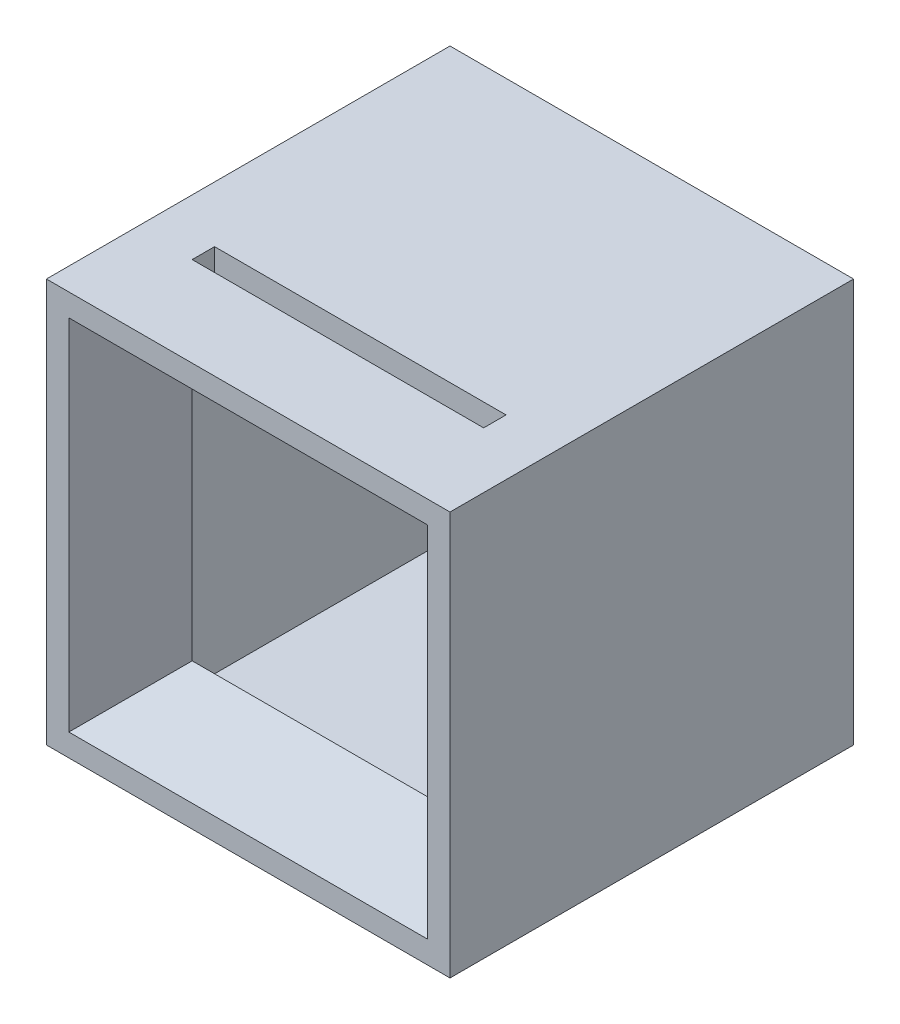
ISO-10303-21;
HEADER;
FILE_DESCRIPTION(('STEP AP214'),'2;1');
FILE_NAME('part.step','',(''),(''),'','','');
FILE_SCHEMA(('AUTOMOTIVE_DESIGN { 1 0 10303 214 1 1 1 1 }'));
ENDSEC;
DATA;
#1=APPLICATION_CONTEXT('core data for automotive mechanical design processes');
#2=APPLICATION_PROTOCOL_DEFINITION('international standard','automotive_design',2000,#1);
#3=PRODUCT_CONTEXT('',#1,'mechanical');
#4=PRODUCT('Part','Part','',(#3));
#5=PRODUCT_RELATED_PRODUCT_CATEGORY('part','',(#4));
#6=PRODUCT_DEFINITION_FORMATION('','',#4);
#7=PRODUCT_DEFINITION_CONTEXT('part definition',#1,'design');
#8=PRODUCT_DEFINITION('design','',#6,#7);
#9=PRODUCT_DEFINITION_SHAPE('','',#8);
#10=(LENGTH_UNIT() NAMED_UNIT(*) SI_UNIT(.MILLI.,.METRE.));
#11=(NAMED_UNIT(*) PLANE_ANGLE_UNIT() SI_UNIT($,.RADIAN.));
#12=(NAMED_UNIT(*) SI_UNIT($,.STERADIAN.) SOLID_ANGLE_UNIT());
#13=UNCERTAINTY_MEASURE_WITH_UNIT(LENGTH_MEASURE(1.E-05),#10,'distance_accuracy_value','');
#14=(GEOMETRIC_REPRESENTATION_CONTEXT(3) GLOBAL_UNCERTAINTY_ASSIGNED_CONTEXT((#13)) GLOBAL_UNIT_ASSIGNED_CONTEXT((#10,
#11,#12)) REPRESENTATION_CONTEXT('',''));
#15=CARTESIAN_POINT('',(0.,0.,0.));
#16=DIRECTION('',(0.,0.,1.));
#17=DIRECTION('',(1.,0.,0.));
#18=AXIS2_PLACEMENT_3D('',#15,#16,#17);
#19=CARTESIAN_POINT('',(0.,0.,457.2));
#20=DIRECTION('',(1.,0.,0.));
#21=DIRECTION('',(0.,0.,-1.));
#22=AXIS2_PLACEMENT_3D('',#19,#20,#21);
#23=PLANE('',#22);
#24=DIRECTION('',(0.,-1.,0.));
#25=VECTOR('',#24,1.);
#26=CARTESIAN_POINT('',(0.,0.,0.));
#27=LINE('',#26,#25);
#28=CARTESIAN_POINT('',(0.,457.2,0.));
#29=VERTEX_POINT('',#28);
#30=CARTESIAN_POINT('',(0.,0.,0.));
#31=VERTEX_POINT('',#30);
#32=EDGE_CURVE('E345',#29,#31,#27,.T.);
#33=ORIENTED_EDGE('',*,*,#32,.T.);
#34=DIRECTION('',(0.,0.,-1.));
#35=VECTOR('',#34,1.);
#36=CARTESIAN_POINT('',(0.,0.,457.2));
#37=LINE('',#36,#35);
#38=CARTESIAN_POINT('',(0.,0.,457.2));
#39=VERTEX_POINT('',#38);
#40=EDGE_CURVE('E369',#39,#31,#37,.T.);
#41=ORIENTED_EDGE('',*,*,#40,.F.);
#42=DIRECTION('',(0.,-1.,0.));
#43=VECTOR('',#42,1.);
#44=CARTESIAN_POINT('',(0.,0.,457.2));
#45=LINE('',#44,#43);
#46=CARTESIAN_POINT('',(0.,457.2,457.2));
#47=VERTEX_POINT('',#46);
#48=EDGE_CURVE('E330',#47,#39,#45,.T.);
#49=ORIENTED_EDGE('',*,*,#48,.F.);
#50=DIRECTION('',(0.,0.,-1.));
#51=VECTOR('',#50,1.);
#52=CARTESIAN_POINT('',(0.,457.2,457.2));
#53=LINE('',#52,#51);
#54=EDGE_CURVE('E344',#47,#29,#53,.T.);
#55=ORIENTED_EDGE('',*,*,#54,.T.);
#56=EDGE_LOOP('',(#33,#41,#49,#55));
#57=FACE_BOUND('',#56,.T.);
#58=ADVANCED_FACE('F52',(#57),#23,.F.);
#59=CARTESIAN_POINT('',(0.,0.,457.2));
#60=DIRECTION('',(0.,1.,0.));
#61=DIRECTION('',(0.,0.,1.));
#62=AXIS2_PLACEMENT_3D('',#59,#60,#61);
#63=PLANE('',#62);
#64=DIRECTION('',(-1.,0.,0.));
#65=VECTOR('',#64,1.);
#66=CARTESIAN_POINT('',(63.5,0.,330.2));
#67=LINE('',#66,#65);
#68=CARTESIAN_POINT('',(393.7,0.,330.2));
#69=VERTEX_POINT('',#68);
#70=CARTESIAN_POINT('',(63.5,0.,330.2));
#71=VERTEX_POINT('',#70);
#72=EDGE_CURVE('E192',#69,#71,#67,.T.);
#73=ORIENTED_EDGE('',*,*,#72,.T.);
#74=DIRECTION('',(0.,0.,1.));
#75=VECTOR('',#74,1.);
#76=CARTESIAN_POINT('',(63.5,0.,355.6));
#77=LINE('',#76,#75);
#78=CARTESIAN_POINT('',(63.5,0.,355.6));
#79=VERTEX_POINT('',#78);
#80=EDGE_CURVE('E173',#71,#79,#77,.T.);
#81=ORIENTED_EDGE('',*,*,#80,.T.);
#82=DIRECTION('',(1.,0.,0.));
#83=VECTOR('',#82,1.);
#84=CARTESIAN_POINT('',(63.5,0.,355.6));
#85=LINE('',#84,#83);
#86=CARTESIAN_POINT('',(393.7,0.,355.6));
#87=VERTEX_POINT('',#86);
#88=EDGE_CURVE('E182',#79,#87,#85,.T.);
#89=ORIENTED_EDGE('',*,*,#88,.T.);
#90=DIRECTION('',(0.,0.,-1.));
#91=VECTOR('',#90,1.);
#92=CARTESIAN_POINT('',(393.7,0.,355.6));
#93=LINE('',#92,#91);
#94=EDGE_CURVE('E187',#87,#69,#93,.T.);
#95=ORIENTED_EDGE('',*,*,#94,.T.);
#96=EDGE_LOOP('',(#73,#81,#89,#95));
#97=FACE_BOUND('',#96,.T.);
#98=DIRECTION('',(1.,0.,0.));
#99=VECTOR('',#98,1.);
#100=CARTESIAN_POINT('',(0.,0.,0.));
#101=LINE('',#100,#99);
#102=CARTESIAN_POINT('',(457.2,0.,0.));
#103=VERTEX_POINT('',#102);
#104=EDGE_CURVE('E349',#31,#103,#101,.T.);
#105=ORIENTED_EDGE('',*,*,#104,.T.);
#106=DIRECTION('',(0.,0.,-1.));
#107=VECTOR('',#106,1.);
#108=CARTESIAN_POINT('',(457.2,0.,457.2));
#109=LINE('',#108,#107);
#110=CARTESIAN_POINT('',(457.2,0.,457.2));
#111=VERTEX_POINT('',#110);
#112=EDGE_CURVE('E365',#111,#103,#109,.T.);
#113=ORIENTED_EDGE('',*,*,#112,.F.);
#114=DIRECTION('',(1.,0.,0.));
#115=VECTOR('',#114,1.);
#116=CARTESIAN_POINT('',(0.,0.,457.2));
#117=LINE('',#116,#115);
#118=EDGE_CURVE('E334',#39,#111,#117,.T.);
#119=ORIENTED_EDGE('',*,*,#118,.F.);
#120=ORIENTED_EDGE('',*,*,#40,.T.);
#121=EDGE_LOOP('',(#105,#113,#119,#120));
#122=FACE_BOUND('',#121,.T.);
#123=ADVANCED_FACE('F189',(#97,#122),#63,.F.);
#124=CARTESIAN_POINT('',(457.2,0.,457.2));
#125=DIRECTION('',(-1.,0.,0.));
#126=DIRECTION('',(0.,0.,1.));
#127=AXIS2_PLACEMENT_3D('',#124,#125,#126);
#128=PLANE('',#127);
#129=DIRECTION('',(0.,1.,0.));
#130=VECTOR('',#129,1.);
#131=CARTESIAN_POINT('',(457.2,0.,0.));
#132=LINE('',#131,#130);
#133=CARTESIAN_POINT('',(457.2,457.2,0.));
#134=VERTEX_POINT('',#133);
#135=EDGE_CURVE('E353',#103,#134,#132,.T.);
#136=ORIENTED_EDGE('',*,*,#135,.T.);
#137=DIRECTION('',(0.,0.,-1.));
#138=VECTOR('',#137,1.);
#139=CARTESIAN_POINT('',(457.2,457.2,457.2));
#140=LINE('',#139,#138);
#141=CARTESIAN_POINT('',(457.2,457.2,457.2));
#142=VERTEX_POINT('',#141);
#143=EDGE_CURVE('E361',#142,#134,#140,.T.);
#144=ORIENTED_EDGE('',*,*,#143,.F.);
#145=DIRECTION('',(0.,1.,0.));
#146=VECTOR('',#145,1.);
#147=CARTESIAN_POINT('',(457.2,0.,457.2));
#148=LINE('',#147,#146);
#149=EDGE_CURVE('E338',#111,#142,#148,.T.);
#150=ORIENTED_EDGE('',*,*,#149,.F.);
#151=ORIENTED_EDGE('',*,*,#112,.T.);
#152=EDGE_LOOP('',(#136,#144,#150,#151));
#153=FACE_BOUND('',#152,.T.);
#154=ADVANCED_FACE('F443',(#153),#128,.F.);
#155=CARTESIAN_POINT('',(0.,457.2,457.2));
#156=DIRECTION('',(0.,-1.,0.));
#157=DIRECTION('',(0.,0.,-1.));
#158=AXIS2_PLACEMENT_3D('',#155,#156,#157);
#159=PLANE('',#158);
#160=DIRECTION('',(-1.,0.,0.));
#161=VECTOR('',#160,1.);
#162=CARTESIAN_POINT('',(0.,457.2,355.6));
#163=LINE('',#162,#161);
#164=CARTESIAN_POINT('',(393.7,457.200006,355.6));
#165=VERTEX_POINT('',#164);
#166=CARTESIAN_POINT('',(63.5,457.2,355.6));
#167=VERTEX_POINT('',#166);
#168=EDGE_CURVE('E203',#165,#167,#163,.T.);
#169=ORIENTED_EDGE('',*,*,#168,.T.);
#170=DIRECTION('',(0.,0.,-1.));
#171=VECTOR('',#170,1.);
#172=CARTESIAN_POINT('',(63.5,457.2,457.2));
#173=LINE('',#172,#171);
#174=CARTESIAN_POINT('',(63.5,457.2,330.2));
#175=VERTEX_POINT('',#174);
#176=EDGE_CURVE('E228',#167,#175,#173,.T.);
#177=ORIENTED_EDGE('',*,*,#176,.T.);
#178=DIRECTION('',(1.,0.,0.));
#179=VECTOR('',#178,1.);
#180=CARTESIAN_POINT('',(0.,457.2,330.2));
#181=LINE('',#180,#179);
#182=CARTESIAN_POINT('',(393.7,457.2,330.2));
#183=VERTEX_POINT('',#182);
#184=EDGE_CURVE('E223',#175,#183,#181,.T.);
#185=ORIENTED_EDGE('',*,*,#184,.T.);
#186=DIRECTION('',(0.,0.,1.));
#187=VECTOR('',#186,1.);
#188=CARTESIAN_POINT('',(393.7,457.2,457.2));
#189=LINE('',#188,#187);
#190=EDGE_CURVE('E224',#183,#165,#189,.T.);
#191=ORIENTED_EDGE('',*,*,#190,.T.);
#192=EDGE_LOOP('',(#169,#177,#185,#191));
#193=FACE_BOUND('',#192,.T.);
#194=DIRECTION('',(-1.,0.,0.));
#195=VECTOR('',#194,1.);
#196=CARTESIAN_POINT('',(0.,457.2,0.));
#197=LINE('',#196,#195);
#198=EDGE_CURVE('E335',#134,#29,#197,.T.);
#199=ORIENTED_EDGE('',*,*,#198,.T.);
#200=ORIENTED_EDGE('',*,*,#54,.F.);
#201=DIRECTION('',(-1.,0.,0.));
#202=VECTOR('',#201,1.);
#203=CARTESIAN_POINT('',(0.,457.2,457.2));
#204=LINE('',#203,#202);
#205=EDGE_CURVE('E341',#142,#47,#204,.T.);
#206=ORIENTED_EDGE('',*,*,#205,.F.);
#207=ORIENTED_EDGE('',*,*,#143,.T.);
#208=EDGE_LOOP('',(#199,#200,#206,#207));
#209=FACE_BOUND('',#208,.T.);
#210=ADVANCED_FACE('F457',(#193,#209),#159,.F.);
#211=CARTESIAN_POINT('',(0.,0.,457.2));
#212=DIRECTION('',(0.,0.,-1.));
#213=DIRECTION('',(-1.,0.,0.));
#214=AXIS2_PLACEMENT_3D('',#211,#212,#213);
#215=PLANE('',#214);
#216=DIRECTION('',(1.,0.,0.));
#217=VECTOR('',#216,1.);
#218=CARTESIAN_POINT('',(25.4,25.4,457.2));
#219=LINE('',#218,#217);
#220=CARTESIAN_POINT('',(25.4,25.4,457.2));
#221=VERTEX_POINT('',#220);
#222=CARTESIAN_POINT('',(431.8,25.4,457.2));
#223=VERTEX_POINT('',#222);
#224=EDGE_CURVE('E274',#221,#223,#219,.T.);
#225=ORIENTED_EDGE('',*,*,#224,.F.);
#226=DIRECTION('',(0.,-1.,0.));
#227=VECTOR('',#226,1.);
#228=CARTESIAN_POINT('',(25.4,25.4,457.2));
#229=LINE('',#228,#227);
#230=CARTESIAN_POINT('',(25.4,431.8,457.2));
#231=VERTEX_POINT('',#230);
#232=EDGE_CURVE('E382',#231,#221,#229,.T.);
#233=ORIENTED_EDGE('',*,*,#232,.F.);
#234=DIRECTION('',(-1.,0.,0.));
#235=VECTOR('',#234,1.);
#236=CARTESIAN_POINT('',(25.4,431.8,457.2));
#237=LINE('',#236,#235);
#238=CARTESIAN_POINT('',(431.8,431.8,457.2));
#239=VERTEX_POINT('',#238);
#240=EDGE_CURVE('E377',#239,#231,#237,.T.);
#241=ORIENTED_EDGE('',*,*,#240,.F.);
#242=DIRECTION('',(0.,1.,0.));
#243=VECTOR('',#242,1.);
#244=CARTESIAN_POINT('',(431.8,25.4,457.2));
#245=LINE('',#244,#243);
#246=EDGE_CURVE('E374',#223,#239,#245,.T.);
#247=ORIENTED_EDGE('',*,*,#246,.F.);
#248=EDGE_LOOP('',(#225,#233,#241,#247));
#249=FACE_BOUND('',#248,.T.);
#250=ORIENTED_EDGE('',*,*,#48,.T.);
#251=ORIENTED_EDGE('',*,*,#118,.T.);
#252=ORIENTED_EDGE('',*,*,#149,.T.);
#253=ORIENTED_EDGE('',*,*,#205,.T.);
#254=EDGE_LOOP('',(#250,#251,#252,#253));
#255=FACE_BOUND('',#254,.T.);
#256=ADVANCED_FACE('F318',(#249,#255),#215,.F.);
#257=CARTESIAN_POINT('',(0.,0.,0.));
#258=DIRECTION('',(0.,0.,-1.));
#259=DIRECTION('',(-1.,0.,0.));
#260=AXIS2_PLACEMENT_3D('',#257,#258,#259);
#261=PLANE('',#260);
#262=DIRECTION('',(-1.,0.,0.));
#263=VECTOR('',#262,1.);
#264=CARTESIAN_POINT('',(393.7,38.1,0.));
#265=LINE('',#264,#263);
#266=CARTESIAN_POINT('',(393.7,38.1,0.));
#267=VERTEX_POINT('',#266);
#268=CARTESIAN_POINT('',(63.5,38.1,0.));
#269=VERTEX_POINT('',#268);
#270=EDGE_CURVE('E250',#267,#269,#265,.T.);
#271=ORIENTED_EDGE('',*,*,#270,.F.);
#272=DIRECTION('',(0.,-1.,0.));
#273=VECTOR('',#272,1.);
#274=CARTESIAN_POINT('',(393.7,0.,0.));
#275=LINE('',#274,#273);
#276=CARTESIAN_POINT('',(393.7,393.7,0.));
#277=VERTEX_POINT('',#276);
#278=EDGE_CURVE('E373',#277,#267,#275,.T.);
#279=ORIENTED_EDGE('',*,*,#278,.F.);
#280=DIRECTION('',(1.,0.,0.));
#281=VECTOR('',#280,1.);
#282=CARTESIAN_POINT('',(0.,393.7,0.));
#283=LINE('',#282,#281);
#284=CARTESIAN_POINT('',(63.5,393.7,0.));
#285=VERTEX_POINT('',#284);
#286=EDGE_CURVE('E399',#285,#277,#283,.T.);
#287=ORIENTED_EDGE('',*,*,#286,.F.);
#288=DIRECTION('',(0.,1.,0.));
#289=VECTOR('',#288,1.);
#290=CARTESIAN_POINT('',(63.5,0.,0.));
#291=LINE('',#290,#289);
#292=EDGE_CURVE('E62',#269,#285,#291,.T.);
#293=ORIENTED_EDGE('',*,*,#292,.F.);
#294=EDGE_LOOP('',(#271,#279,#287,#293));
#295=FACE_BOUND('',#294,.T.);
#296=ORIENTED_EDGE('',*,*,#32,.F.);
#297=ORIENTED_EDGE('',*,*,#198,.F.);
#298=ORIENTED_EDGE('',*,*,#135,.F.);
#299=ORIENTED_EDGE('',*,*,#104,.F.);
#300=EDGE_LOOP('',(#296,#297,#298,#299));
#301=FACE_BOUND('',#300,.T.);
#302=ADVANCED_FACE('F302',(#295,#301),#261,.T.);
#303=CARTESIAN_POINT('',(172.580821917808,0.,64.7178082191781));
#304=DIRECTION('',(-0.936329177569044,0.,-0.351123441588392));
#305=DIRECTION('',(-0.351123441588392,0.,0.936329177569045));
#306=AXIS2_PLACEMENT_3D('',#303,#304,#305);
#307=PLANE('',#306);
#308=DIRECTION('',(0.33129457822454,-0.33129457822454,-0.883452208598772));
#309=VECTOR('',#308,1.);
#310=CARTESIAN_POINT('',(25.4,431.8,457.2));
#311=LINE('',#310,#309);
#312=CARTESIAN_POINT('',(63.5,393.7,355.6));
#313=VERTEX_POINT('',#312);
#314=EDGE_CURVE('E262',#231,#313,#311,.T.);
#315=ORIENTED_EDGE('',*,*,#314,.F.);
#316=ORIENTED_EDGE('',*,*,#232,.T.);
#317=DIRECTION('',(0.33129457822454,0.33129457822454,-0.883452208598772));
#318=VECTOR('',#317,1.);
#319=CARTESIAN_POINT('',(25.4,25.4,457.2));
#320=LINE('',#319,#318);
#321=CARTESIAN_POINT('',(63.5,63.5,355.6));
#322=VERTEX_POINT('',#321);
#323=EDGE_CURVE('E257',#221,#322,#320,.T.);
#324=ORIENTED_EDGE('',*,*,#323,.T.);
#325=DIRECTION('',(0.,-1.,0.));
#326=VECTOR('',#325,1.);
#327=CARTESIAN_POINT('',(63.5,63.5,355.6));
#328=LINE('',#327,#326);
#329=EDGE_CURVE('E55',#313,#322,#328,.T.);
#330=ORIENTED_EDGE('',*,*,#329,.F.);
#331=EDGE_LOOP('',(#315,#316,#324,#330));
#332=FACE_BOUND('',#331,.T.);
#333=ADVANCED_FACE('F291',(#332),#307,.F.);
#334=CARTESIAN_POINT('',(0.,172.580821917808,64.7178082191781));
#335=DIRECTION('',(0.,-0.936329177569044,-0.351123441588392));
#336=DIRECTION('',(0.,0.351123441588392,-0.936329177569045));
#337=AXIS2_PLACEMENT_3D('',#334,#335,#336);
#338=PLANE('',#337);
#339=ORIENTED_EDGE('',*,*,#323,.F.);
#340=ORIENTED_EDGE('',*,*,#224,.T.);
#341=DIRECTION('',(-0.33129457822454,0.33129457822454,-0.883452208598772));
#342=VECTOR('',#341,1.);
#343=CARTESIAN_POINT('',(431.8,25.4,457.2));
#344=LINE('',#343,#342);
#345=CARTESIAN_POINT('',(393.7,63.5,355.6));
#346=VERTEX_POINT('',#345);
#347=EDGE_CURVE('E265',#223,#346,#344,.T.);
#348=ORIENTED_EDGE('',*,*,#347,.T.);
#349=DIRECTION('',(1.,0.,0.));
#350=VECTOR('',#349,1.);
#351=CARTESIAN_POINT('',(63.5,63.5,355.6));
#352=LINE('',#351,#350);
#353=EDGE_CURVE('E350',#322,#346,#352,.T.);
#354=ORIENTED_EDGE('',*,*,#353,.F.);
#355=EDGE_LOOP('',(#339,#340,#348,#354));
#356=FACE_BOUND('',#355,.T.);
#357=ADVANCED_FACE('F301',(#356),#338,.F.);
#358=CARTESIAN_POINT('',(0.,228.25205479452,-85.5945205479452));
#359=DIRECTION('',(0.,0.936329177569044,-0.351123441588392));
#360=DIRECTION('',(0.,0.351123441588392,0.936329177569045));
#361=AXIS2_PLACEMENT_3D('',#358,#359,#360);
#362=PLANE('',#361);
#363=DIRECTION('',(-0.33129457822454,-0.33129457822454,-0.883452208598772));
#364=VECTOR('',#363,1.);
#365=CARTESIAN_POINT('',(431.8,431.8,457.2));
#366=LINE('',#365,#364);
#367=CARTESIAN_POINT('',(393.7,393.7,355.6));
#368=VERTEX_POINT('',#367);
#369=EDGE_CURVE('E261',#239,#368,#366,.T.);
#370=ORIENTED_EDGE('',*,*,#369,.F.);
#371=ORIENTED_EDGE('',*,*,#240,.T.);
#372=ORIENTED_EDGE('',*,*,#314,.T.);
#373=DIRECTION('',(-1.,0.,0.));
#374=VECTOR('',#373,1.);
#375=CARTESIAN_POINT('',(63.5,393.7,355.6));
#376=LINE('',#375,#374);
#377=EDGE_CURVE('E492',#368,#313,#376,.T.);
#378=ORIENTED_EDGE('',*,*,#377,.F.);
#379=EDGE_LOOP('',(#370,#371,#372,#378));
#380=FACE_BOUND('',#379,.T.);
#381=ADVANCED_FACE('F308',(#380),#362,.F.);
#382=CARTESIAN_POINT('',(228.25205479452,0.,-85.5945205479452));
#383=DIRECTION('',(0.936329177569044,0.,-0.351123441588392));
#384=DIRECTION('',(-0.351123441588392,0.,-0.936329177569044));
#385=AXIS2_PLACEMENT_3D('',#382,#383,#384);
#386=PLANE('',#385);
#387=ORIENTED_EDGE('',*,*,#347,.F.);
#388=ORIENTED_EDGE('',*,*,#246,.T.);
#389=ORIENTED_EDGE('',*,*,#369,.T.);
#390=DIRECTION('',(0.,1.,0.));
#391=VECTOR('',#390,1.);
#392=CARTESIAN_POINT('',(393.7,63.5,355.6));
#393=LINE('',#392,#391);
#394=EDGE_CURVE('E242',#346,#368,#393,.T.);
#395=ORIENTED_EDGE('',*,*,#394,.F.);
#396=EDGE_LOOP('',(#387,#388,#389,#395));
#397=FACE_BOUND('',#396,.T.);
#398=ADVANCED_FACE('F312',(#397),#386,.F.);
#399=CARTESIAN_POINT('',(63.5,393.7,-101.6));
#400=DIRECTION('',(-1.,0.,0.));
#401=DIRECTION('',(0.,0.,1.));
#402=AXIS2_PLACEMENT_3D('',#399,#400,#401);
#403=PLANE('',#402);
#404=DIRECTION('',(0.,0.,1.));
#405=VECTOR('',#404,1.);
#406=CARTESIAN_POINT('',(63.5,393.7,-101.6));
#407=LINE('',#406,#405);
#408=CARTESIAN_POINT('',(63.5,393.7,330.2));
#409=VERTEX_POINT('',#408);
#410=EDGE_CURVE('E393',#285,#409,#407,.T.);
#411=ORIENTED_EDGE('',*,*,#410,.T.);
#412=DIRECTION('',(0.,1.,0.));
#413=VECTOR('',#412,1.);
#414=CARTESIAN_POINT('',(63.5,0.,330.2));
#415=LINE('',#414,#413);
#416=EDGE_CURVE('E204',#409,#175,#415,.T.);
#417=ORIENTED_EDGE('',*,*,#416,.T.);
#418=ORIENTED_EDGE('',*,*,#176,.F.);
#419=DIRECTION('',(0.,1.,0.));
#420=VECTOR('',#419,1.);
#421=CARTESIAN_POINT('',(63.5,0.,355.6));
#422=LINE('',#421,#420);
#423=EDGE_CURVE('E78',#313,#167,#422,.T.);
#424=ORIENTED_EDGE('',*,*,#423,.F.);
#425=ORIENTED_EDGE('',*,*,#329,.T.);
#426=DIRECTION('',(0.,1.,0.));
#427=VECTOR('',#426,1.);
#428=CARTESIAN_POINT('',(63.5,38.1,355.6));
#429=LINE('',#428,#427);
#430=EDGE_CURVE('E168',#79,#322,#429,.T.);
#431=ORIENTED_EDGE('',*,*,#430,.F.);
#432=ORIENTED_EDGE('',*,*,#80,.F.);
#433=CARTESIAN_POINT('',(63.5,38.1,330.2));
#434=VERTEX_POINT('',#433);
#435=EDGE_CURVE('E200',#71,#434,#415,.T.);
#436=ORIENTED_EDGE('',*,*,#435,.T.);
#437=DIRECTION('',(0.,0.,1.));
#438=VECTOR('',#437,1.);
#439=CARTESIAN_POINT('',(63.5,38.1,0.));
#440=LINE('',#439,#438);
#441=EDGE_CURVE('E179',#269,#434,#440,.T.);
#442=ORIENTED_EDGE('',*,*,#441,.F.);
#443=ORIENTED_EDGE('',*,*,#292,.T.);
#444=EDGE_LOOP('',(#411,#417,#418,#424,#425,#431,#432,#436,#442,#443));
#445=FACE_BOUND('',#444,.T.);
#446=ADVANCED_FACE('F170',(#445),#403,.F.);
#447=CARTESIAN_POINT('',(393.7,393.7,-101.6));
#448=DIRECTION('',(0.,1.,0.));
#449=DIRECTION('',(0.,0.,1.));
#450=AXIS2_PLACEMENT_3D('',#447,#448,#449);
#451=PLANE('',#450);
#452=DIRECTION('',(0.,0.,1.));
#453=VECTOR('',#452,1.);
#454=CARTESIAN_POINT('',(393.7,393.7,-101.6));
#455=LINE('',#454,#453);
#456=CARTESIAN_POINT('',(393.7,393.7,330.2));
#457=VERTEX_POINT('',#456);
#458=EDGE_CURVE('E405',#277,#457,#455,.T.);
#459=ORIENTED_EDGE('',*,*,#458,.T.);
#460=DIRECTION('',(-1.,0.,0.));
#461=VECTOR('',#460,1.);
#462=CARTESIAN_POINT('',(393.7,393.7,330.2));
#463=LINE('',#462,#461);
#464=EDGE_CURVE('E219',#457,#409,#463,.T.);
#465=ORIENTED_EDGE('',*,*,#464,.T.);
#466=ORIENTED_EDGE('',*,*,#410,.F.);
#467=ORIENTED_EDGE('',*,*,#286,.T.);
#468=EDGE_LOOP('',(#459,#465,#466,#467));
#469=FACE_BOUND('',#468,.T.);
#470=ADVANCED_FACE('F429',(#469),#451,.F.);
#471=CARTESIAN_POINT('',(393.7,63.5,-101.6));
#472=DIRECTION('',(1.,0.,0.));
#473=DIRECTION('',(0.,0.,-1.));
#474=AXIS2_PLACEMENT_3D('',#471,#472,#473);
#475=PLANE('',#474);
#476=DIRECTION('',(0.,0.,-1.));
#477=VECTOR('',#476,1.);
#478=CARTESIAN_POINT('',(393.7,38.1,355.6));
#479=LINE('',#478,#477);
#480=CARTESIAN_POINT('',(393.7,38.1,330.2));
#481=VERTEX_POINT('',#480);
#482=EDGE_CURVE('E233',#481,#267,#479,.T.);
#483=ORIENTED_EDGE('',*,*,#482,.F.);
#484=DIRECTION('',(0.,1.,0.));
#485=VECTOR('',#484,1.);
#486=CARTESIAN_POINT('',(393.7,0.,330.2));
#487=LINE('',#486,#485);
#488=EDGE_CURVE('E205',#69,#481,#487,.T.);
#489=ORIENTED_EDGE('',*,*,#488,.F.);
#490=ORIENTED_EDGE('',*,*,#94,.F.);
#491=DIRECTION('',(0.,1.,0.));
#492=VECTOR('',#491,1.);
#493=CARTESIAN_POINT('',(393.7,38.1,355.6));
#494=LINE('',#493,#492);
#495=EDGE_CURVE('E70',#87,#346,#494,.T.);
#496=ORIENTED_EDGE('',*,*,#495,.T.);
#497=ORIENTED_EDGE('',*,*,#394,.T.);
#498=DIRECTION('',(0.,1.,0.));
#499=VECTOR('',#498,1.);
#500=CARTESIAN_POINT('',(393.7,0.,355.6));
#501=LINE('',#500,#499);
#502=EDGE_CURVE('E213',#368,#165,#501,.T.);
#503=ORIENTED_EDGE('',*,*,#502,.T.);
#504=ORIENTED_EDGE('',*,*,#190,.F.);
#505=EDGE_CURVE('E208',#457,#183,#487,.T.);
#506=ORIENTED_EDGE('',*,*,#505,.F.);
#507=ORIENTED_EDGE('',*,*,#458,.F.);
#508=ORIENTED_EDGE('',*,*,#278,.T.);
#509=EDGE_LOOP('',(#483,#489,#490,#496,#497,#503,#504,#506,#507,#508));
#510=FACE_BOUND('',#509,.T.);
#511=ADVANCED_FACE('F303',(#510),#475,.F.);
#512=CARTESIAN_POINT('',(63.5,38.1,355.6));
#513=DIRECTION('',(0.,0.,1.));
#514=DIRECTION('',(1.,0.,0.));
#515=AXIS2_PLACEMENT_3D('',#512,#513,#514);
#516=PLANE('',#515);
#517=ORIENTED_EDGE('',*,*,#353,.T.);
#518=ORIENTED_EDGE('',*,*,#495,.F.);
#519=ORIENTED_EDGE('',*,*,#88,.F.);
#520=ORIENTED_EDGE('',*,*,#430,.T.);
#521=EDGE_LOOP('',(#517,#518,#519,#520));
#522=FACE_BOUND('',#521,.T.);
#523=ADVANCED_FACE('F183',(#522),#516,.F.);
#524=CARTESIAN_POINT('',(0.,38.1,0.));
#525=DIRECTION('',(0.,1.,0.));
#526=DIRECTION('',(0.,0.,1.));
#527=AXIS2_PLACEMENT_3D('',#524,#525,#526);
#528=PLANE('',#527);
#529=DIRECTION('',(-1.,0.,0.));
#530=VECTOR('',#529,1.);
#531=CARTESIAN_POINT('',(0.,38.1,330.2));
#532=LINE('',#531,#530);
#533=EDGE_CURVE('E12',#481,#434,#532,.T.);
#534=ORIENTED_EDGE('',*,*,#533,.F.);
#535=ORIENTED_EDGE('',*,*,#482,.T.);
#536=ORIENTED_EDGE('',*,*,#270,.T.);
#537=ORIENTED_EDGE('',*,*,#441,.T.);
#538=EDGE_LOOP('',(#534,#535,#536,#537));
#539=FACE_BOUND('',#538,.T.);
#540=ADVANCED_FACE('F477',(#539),#528,.T.);
#541=CARTESIAN_POINT('',(63.5,0.,330.2));
#542=DIRECTION('',(0.,0.,-1.));
#543=DIRECTION('',(-1.,0.,0.));
#544=AXIS2_PLACEMENT_3D('',#541,#542,#543);
#545=PLANE('',#544);
#546=ORIENTED_EDGE('',*,*,#533,.T.);
#547=ORIENTED_EDGE('',*,*,#435,.F.);
#548=ORIENTED_EDGE('',*,*,#72,.F.);
#549=ORIENTED_EDGE('',*,*,#488,.T.);
#550=EDGE_LOOP('',(#546,#547,#548,#549));
#551=FACE_BOUND('',#550,.T.);
#552=ADVANCED_FACE('F484',(#551),#545,.F.);
#553=ORIENTED_EDGE('',*,*,#416,.F.);
#554=ORIENTED_EDGE('',*,*,#464,.F.);
#555=ORIENTED_EDGE('',*,*,#505,.T.);
#556=ORIENTED_EDGE('',*,*,#184,.F.);
#557=EDGE_LOOP('',(#553,#554,#555,#556));
#558=FACE_BOUND('',#557,.T.);
#559=ADVANCED_FACE('F503',(#558),#545,.F.);
#560=CARTESIAN_POINT('',(63.5,0.,355.6));
#561=DIRECTION('',(0.,0.,1.));
#562=DIRECTION('',(1.,0.,0.));
#563=AXIS2_PLACEMENT_3D('',#560,#561,#562);
#564=PLANE('',#563);
#565=ORIENTED_EDGE('',*,*,#502,.F.);
#566=ORIENTED_EDGE('',*,*,#377,.T.);
#567=ORIENTED_EDGE('',*,*,#423,.T.);
#568=ORIENTED_EDGE('',*,*,#168,.F.);
#569=EDGE_LOOP('',(#565,#566,#567,#568));
#570=FACE_BOUND('',#569,.T.);
#571=ADVANCED_FACE('F506',(#570),#564,.F.);
#572=CLOSED_SHELL('',(#58,#123,#154,#210,#256,#302,#333,#357,#381,#398,#446,#470,#511,#523,#540,
#552,#559,#571));
#573=MANIFOLD_SOLID_BREP('B2',#572);
#574=ADVANCED_BREP_SHAPE_REPRESENTATION('',(#18,#573),#14);
#575=SHAPE_DEFINITION_REPRESENTATION(#9,#574);
ENDSEC;
END-ISO-10303-21;
